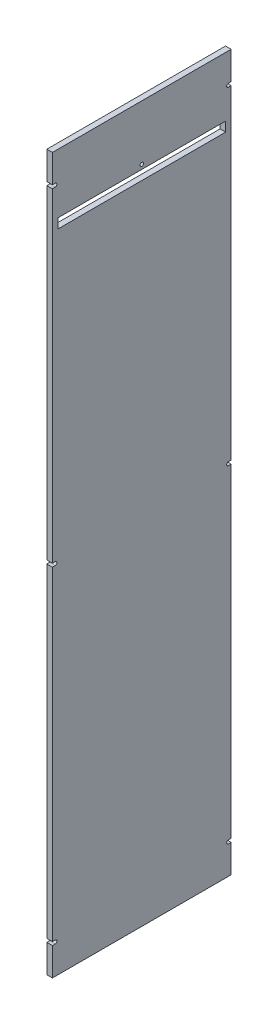
ISO-10303-21;
HEADER;
FILE_DESCRIPTION(('STEP AP214'),'2;1');
FILE_NAME('part.step','',(''),(''),'','','');
FILE_SCHEMA(('AUTOMOTIVE_DESIGN { 1 0 10303 214 1 1 1 1 }'));
ENDSEC;
DATA;
#1=APPLICATION_CONTEXT('core data for automotive mechanical design processes');
#2=APPLICATION_PROTOCOL_DEFINITION('international standard','automotive_design',2000,#1);
#3=PRODUCT_CONTEXT('',#1,'mechanical');
#4=PRODUCT('Part','Part','',(#3));
#5=PRODUCT_RELATED_PRODUCT_CATEGORY('part','',(#4));
#6=PRODUCT_DEFINITION_FORMATION('','',#4);
#7=PRODUCT_DEFINITION_CONTEXT('part definition',#1,'design');
#8=PRODUCT_DEFINITION('design','',#6,#7);
#9=PRODUCT_DEFINITION_SHAPE('','',#8);
#10=(LENGTH_UNIT() NAMED_UNIT(*) SI_UNIT(.MILLI.,.METRE.));
#11=(NAMED_UNIT(*) PLANE_ANGLE_UNIT() SI_UNIT($,.RADIAN.));
#12=(NAMED_UNIT(*) SI_UNIT($,.STERADIAN.) SOLID_ANGLE_UNIT());
#13=UNCERTAINTY_MEASURE_WITH_UNIT(LENGTH_MEASURE(1.E-05),#10,'distance_accuracy_value','');
#14=(GEOMETRIC_REPRESENTATION_CONTEXT(3) GLOBAL_UNCERTAINTY_ASSIGNED_CONTEXT((#13)) GLOBAL_UNIT_ASSIGNED_CONTEXT((#10,
#11,#12)) REPRESENTATION_CONTEXT('',''));
#15=CARTESIAN_POINT('',(0.,0.,0.));
#16=DIRECTION('',(0.,0.,1.));
#17=DIRECTION('',(1.,0.,0.));
#18=AXIS2_PLACEMENT_3D('',#15,#16,#17);
#19=CARTESIAN_POINT('',(0.,609.6,0.));
#20=DIRECTION('',(0.,0.,-1.));
#21=DIRECTION('',(-1.,0.,0.));
#22=AXIS2_PLACEMENT_3D('',#19,#20,#21);
#23=PLANE('',#22);
#24=DIRECTION('',(0.,-1.,0.));
#25=VECTOR('',#24,1.);
#26=CARTESIAN_POINT('',(0.,609.6,0.));
#27=LINE('',#26,#25);
#28=CARTESIAN_POINT('',(0.,303.3395,0.));
#29=VERTEX_POINT('',#28);
#30=CARTESIAN_POINT('',(0.,26.8605000000001,0.));
#31=VERTEX_POINT('',#30);
#32=EDGE_CURVE('E480',#29,#31,#27,.T.);
#33=ORIENTED_EDGE('',*,*,#32,.T.);
#34=DIRECTION('',(-1.,0.,0.));
#35=VECTOR('',#34,1.);
#36=CARTESIAN_POINT('',(4.7625,26.8605000000001,0.));
#37=LINE('',#36,#35);
#38=CARTESIAN_POINT('',(4.7625,26.8605000000001,0.));
#39=VERTEX_POINT('',#38);
#40=EDGE_CURVE('E336',#39,#31,#37,.T.);
#41=ORIENTED_EDGE('',*,*,#40,.F.);
#42=DIRECTION('',(0.,-1.,0.));
#43=VECTOR('',#42,1.);
#44=CARTESIAN_POINT('',(4.7625,609.6,0.));
#45=LINE('',#44,#43);
#46=CARTESIAN_POINT('',(4.7625,303.3395,0.));
#47=VERTEX_POINT('',#46);
#48=EDGE_CURVE('E482',#47,#39,#45,.T.);
#49=ORIENTED_EDGE('',*,*,#48,.F.);
#50=DIRECTION('',(-1.,0.,0.));
#51=VECTOR('',#50,1.);
#52=CARTESIAN_POINT('',(4.7625,303.3395,0.));
#53=LINE('',#52,#51);
#54=EDGE_CURVE('E312',#47,#29,#53,.T.);
#55=ORIENTED_EDGE('',*,*,#54,.T.);
#56=EDGE_LOOP('',(#33,#41,#49,#55));
#57=FACE_BOUND('',#56,.T.);
#58=ADVANCED_FACE('F35',(#57),#23,.F.);
#59=CARTESIAN_POINT('',(0.,582.7395,0.));
#60=VERTEX_POINT('',#59);
#61=CARTESIAN_POINT('',(0.,306.2605,0.));
#62=VERTEX_POINT('',#61);
#63=EDGE_CURVE('E43',#60,#62,#27,.T.);
#64=ORIENTED_EDGE('',*,*,#63,.T.);
#65=DIRECTION('',(-1.,0.,0.));
#66=VECTOR('',#65,1.);
#67=CARTESIAN_POINT('',(4.7625,306.2605,0.));
#68=LINE('',#67,#66);
#69=CARTESIAN_POINT('',(4.7625,306.2605,0.));
#70=VERTEX_POINT('',#69);
#71=EDGE_CURVE('E310',#70,#62,#68,.T.);
#72=ORIENTED_EDGE('',*,*,#71,.F.);
#73=CARTESIAN_POINT('',(4.7625,582.7395,0.));
#74=VERTEX_POINT('',#73);
#75=EDGE_CURVE('E476',#74,#70,#45,.T.);
#76=ORIENTED_EDGE('',*,*,#75,.F.);
#77=DIRECTION('',(-1.,0.,0.));
#78=VECTOR('',#77,1.);
#79=CARTESIAN_POINT('',(4.7625,582.7395,0.));
#80=LINE('',#79,#78);
#81=EDGE_CURVE('E440',#74,#60,#80,.T.);
#82=ORIENTED_EDGE('',*,*,#81,.T.);
#83=EDGE_LOOP('',(#64,#72,#76,#82));
#84=FACE_BOUND('',#83,.T.);
#85=ADVANCED_FACE('F546',(#84),#23,.F.);
#86=CARTESIAN_POINT('',(0.,609.6,-152.4));
#87=DIRECTION('',(0.,0.,1.));
#88=DIRECTION('',(1.,0.,0.));
#89=AXIS2_PLACEMENT_3D('',#86,#87,#88);
#90=PLANE('',#89);
#91=DIRECTION('',(0.,-1.,0.));
#92=VECTOR('',#91,1.);
#93=CARTESIAN_POINT('',(0.,609.6,-152.4));
#94=LINE('',#93,#92);
#95=CARTESIAN_POINT('',(0.,23.9395,-152.4));
#96=VERTEX_POINT('',#95);
#97=CARTESIAN_POINT('',(0.,0.,-152.4));
#98=VERTEX_POINT('',#97);
#99=EDGE_CURVE('E454',#96,#98,#94,.T.);
#100=ORIENTED_EDGE('',*,*,#99,.F.);
#101=DIRECTION('',(-1.,0.,0.));
#102=VECTOR('',#101,1.);
#103=CARTESIAN_POINT('',(4.7625,23.9395,-152.4));
#104=LINE('',#103,#102);
#105=CARTESIAN_POINT('',(4.7625,23.9395,-152.4));
#106=VERTEX_POINT('',#105);
#107=EDGE_CURVE('E360',#106,#96,#104,.T.);
#108=ORIENTED_EDGE('',*,*,#107,.F.);
#109=DIRECTION('',(0.,-1.,0.));
#110=VECTOR('',#109,1.);
#111=CARTESIAN_POINT('',(4.7625,609.6,-152.4));
#112=LINE('',#111,#110);
#113=CARTESIAN_POINT('',(4.7625,0.,-152.4));
#114=VERTEX_POINT('',#113);
#115=EDGE_CURVE('E468',#106,#114,#112,.T.);
#116=ORIENTED_EDGE('',*,*,#115,.T.);
#117=DIRECTION('',(-1.,0.,0.));
#118=VECTOR('',#117,1.);
#119=CARTESIAN_POINT('',(0.,0.,-152.4));
#120=LINE('',#119,#118);
#121=EDGE_CURVE('E448',#114,#98,#120,.T.);
#122=ORIENTED_EDGE('',*,*,#121,.T.);
#123=EDGE_LOOP('',(#100,#108,#116,#122));
#124=FACE_BOUND('',#123,.T.);
#125=ADVANCED_FACE('F543',(#124),#90,.F.);
#126=CARTESIAN_POINT('',(4.7625,303.3395,-152.4));
#127=VERTEX_POINT('',#126);
#128=CARTESIAN_POINT('',(4.7625,26.8605000000001,-152.4));
#129=VERTEX_POINT('',#128);
#130=EDGE_CURVE('E516',#127,#129,#112,.T.);
#131=ORIENTED_EDGE('',*,*,#130,.T.);
#132=DIRECTION('',(-1.,0.,0.));
#133=VECTOR('',#132,1.);
#134=CARTESIAN_POINT('',(4.7625,26.8605000000001,-152.4));
#135=LINE('',#134,#133);
#136=CARTESIAN_POINT('',(0.,26.8605000000003,-152.4));
#137=VERTEX_POINT('',#136);
#138=EDGE_CURVE('E362',#129,#137,#135,.T.);
#139=ORIENTED_EDGE('',*,*,#138,.T.);
#140=CARTESIAN_POINT('',(0.,303.3395,-152.4));
#141=VERTEX_POINT('',#140);
#142=EDGE_CURVE('E537',#141,#137,#94,.T.);
#143=ORIENTED_EDGE('',*,*,#142,.F.);
#144=DIRECTION('',(-1.,0.,0.));
#145=VECTOR('',#144,1.);
#146=CARTESIAN_POINT('',(4.7625,303.3395,-152.4));
#147=LINE('',#146,#145);
#148=EDGE_CURVE('E412',#127,#141,#147,.T.);
#149=ORIENTED_EDGE('',*,*,#148,.F.);
#150=EDGE_LOOP('',(#131,#139,#143,#149));
#151=FACE_BOUND('',#150,.T.);
#152=ADVANCED_FACE('F545',(#151),#90,.F.);
#153=CARTESIAN_POINT('',(4.7625,582.7395,-152.4));
#154=VERTEX_POINT('',#153);
#155=CARTESIAN_POINT('',(4.7625,306.2605,-152.4));
#156=VERTEX_POINT('',#155);
#157=EDGE_CURVE('E473',#154,#156,#112,.T.);
#158=ORIENTED_EDGE('',*,*,#157,.T.);
#159=DIRECTION('',(-1.,0.,0.));
#160=VECTOR('',#159,1.);
#161=CARTESIAN_POINT('',(4.7625,306.2605,-152.4));
#162=LINE('',#161,#160);
#163=CARTESIAN_POINT('',(0.,306.2605,-152.4));
#164=VERTEX_POINT('',#163);
#165=EDGE_CURVE('E414',#156,#164,#162,.T.);
#166=ORIENTED_EDGE('',*,*,#165,.T.);
#167=CARTESIAN_POINT('',(0.,582.7395,-152.4));
#168=VERTEX_POINT('',#167);
#169=EDGE_CURVE('E469',#168,#164,#94,.T.);
#170=ORIENTED_EDGE('',*,*,#169,.F.);
#171=DIRECTION('',(-1.,0.,0.));
#172=VECTOR('',#171,1.);
#173=CARTESIAN_POINT('',(4.7625,582.7395,-152.4));
#174=LINE('',#173,#172);
#175=EDGE_CURVE('E388',#154,#168,#174,.T.);
#176=ORIENTED_EDGE('',*,*,#175,.F.);
#177=EDGE_LOOP('',(#158,#166,#170,#176));
#178=FACE_BOUND('',#177,.T.);
#179=ADVANCED_FACE('F525',(#178),#90,.F.);
#180=CARTESIAN_POINT('',(0.,609.6,0.));
#181=VERTEX_POINT('',#180);
#182=CARTESIAN_POINT('',(0.,585.6605,0.));
#183=VERTEX_POINT('',#182);
#184=EDGE_CURVE('E11',#181,#183,#27,.T.);
#185=ORIENTED_EDGE('',*,*,#184,.T.);
#186=DIRECTION('',(-1.,0.,0.));
#187=VECTOR('',#186,1.);
#188=CARTESIAN_POINT('',(4.7625,585.6605,0.));
#189=LINE('',#188,#187);
#190=CARTESIAN_POINT('',(4.7625,585.6605,0.));
#191=VERTEX_POINT('',#190);
#192=EDGE_CURVE('E438',#191,#183,#189,.T.);
#193=ORIENTED_EDGE('',*,*,#192,.F.);
#194=CARTESIAN_POINT('',(4.7625,609.6,0.));
#195=VERTEX_POINT('',#194);
#196=EDGE_CURVE('E474',#195,#191,#45,.T.);
#197=ORIENTED_EDGE('',*,*,#196,.F.);
#198=DIRECTION('',(1.,0.,0.));
#199=VECTOR('',#198,1.);
#200=CARTESIAN_POINT('',(0.,609.6,0.));
#201=LINE('',#200,#199);
#202=EDGE_CURVE('E447',#181,#195,#201,.T.);
#203=ORIENTED_EDGE('',*,*,#202,.F.);
#204=EDGE_LOOP('',(#185,#193,#197,#203));
#205=FACE_BOUND('',#204,.T.);
#206=ADVANCED_FACE('F554',(#205),#23,.F.);
#207=CARTESIAN_POINT('',(0.,609.6,0.));
#208=DIRECTION('',(1.,0.,0.));
#209=DIRECTION('',(0.,0.,-1.));
#210=AXIS2_PLACEMENT_3D('',#207,#208,#209);
#211=PLANE('',#210);
#212=DIRECTION('',(0.,1.,0.));
#213=VECTOR('',#212,1.);
#214=CARTESIAN_POINT('',(0.,558.927,-4.6355));
#215=LINE('',#214,#213);
#216=CARTESIAN_POINT('',(0.,550.7355,-4.6355));
#217=VERTEX_POINT('',#216);
#218=CARTESIAN_POINT('',(0.,558.927,-4.6355));
#219=VERTEX_POINT('',#218);
#220=EDGE_CURVE('E272',#217,#219,#215,.T.);
#221=ORIENTED_EDGE('',*,*,#220,.F.);
#222=DIRECTION('',(0.,0.,1.));
#223=VECTOR('',#222,1.);
#224=CARTESIAN_POINT('',(0.,550.7355,-4.6355));
#225=LINE('',#224,#223);
#226=CARTESIAN_POINT('',(0.,550.7355,-147.7645));
#227=VERTEX_POINT('',#226);
#228=EDGE_CURVE('E51',#227,#217,#225,.T.);
#229=ORIENTED_EDGE('',*,*,#228,.F.);
#230=DIRECTION('',(0.,-1.,0.));
#231=VECTOR('',#230,1.);
#232=CARTESIAN_POINT('',(0.,550.7355,-147.7645));
#233=LINE('',#232,#231);
#234=CARTESIAN_POINT('',(0.,558.927,-147.7645));
#235=VERTEX_POINT('',#234);
#236=EDGE_CURVE('E263',#235,#227,#233,.T.);
#237=ORIENTED_EDGE('',*,*,#236,.F.);
#238=DIRECTION('',(0.,0.,-1.));
#239=VECTOR('',#238,1.);
#240=CARTESIAN_POINT('',(0.,558.927,-147.7645));
#241=LINE('',#240,#239);
#242=EDGE_CURVE('E266',#219,#235,#241,.T.);
#243=ORIENTED_EDGE('',*,*,#242,.F.);
#244=EDGE_LOOP('',(#221,#229,#237,#243));
#245=FACE_BOUND('',#244,.T.);
#246=CARTESIAN_POINT('',(0.,562.76875,-76.2));
#247=DIRECTION('',(-1.,0.,0.));
#248=DIRECTION('',(0.,0.,1.));
#249=AXIS2_PLACEMENT_3D('',#246,#247,#248);
#250=CIRCLE('',#249,1.47319999999995);
#251=CARTESIAN_POINT('',(0.,562.76875,-74.7268000000001));
#252=VERTEX_POINT('',#251);
#253=EDGE_CURVE('E278',#252,#252,#250,.T.);
#254=ORIENTED_EDGE('',*,*,#253,.F.);
#255=EDGE_LOOP('',(#254));
#256=FACE_BOUND('',#255,.T.);
#257=CARTESIAN_POINT('',(0.,25.4,-150.01875));
#258=DIRECTION('',(-1.,0.,0.));
#259=DIRECTION('',(0.,0.,1.));
#260=AXIS2_PLACEMENT_3D('',#257,#258,#259);
#261=CIRCLE('',#260,1.46050000000005);
#262=CARTESIAN_POINT('',(0.,23.9395,-150.01875));
#263=VERTEX_POINT('',#262);
#264=CARTESIAN_POINT('',(0.,26.8605000000001,-150.01875));
#265=VERTEX_POINT('',#264);
#266=EDGE_CURVE('E287',#263,#265,#261,.T.);
#267=ORIENTED_EDGE('',*,*,#266,.F.);
#268=DIRECTION('',(0.,0.,1.));
#269=VECTOR('',#268,1.);
#270=CARTESIAN_POINT('',(0.,23.9395,-150.01875));
#271=LINE('',#270,#269);
#272=EDGE_CURVE('E346',#96,#263,#271,.T.);
#273=ORIENTED_EDGE('',*,*,#272,.F.);
#274=ORIENTED_EDGE('',*,*,#99,.T.);
#275=DIRECTION('',(0.,0.,1.));
#276=VECTOR('',#275,1.);
#277=CARTESIAN_POINT('',(0.,0.,0.));
#278=LINE('',#277,#276);
#279=CARTESIAN_POINT('',(0.,0.,0.));
#280=VERTEX_POINT('',#279);
#281=EDGE_CURVE('E437',#98,#280,#278,.T.);
#282=ORIENTED_EDGE('',*,*,#281,.T.);
#283=CARTESIAN_POINT('',(0.,23.9395,0.));
#284=VERTEX_POINT('',#283);
#285=EDGE_CURVE('E44',#284,#280,#27,.T.);
#286=ORIENTED_EDGE('',*,*,#285,.F.);
#287=DIRECTION('',(0.,0.,1.));
#288=VECTOR('',#287,1.);
#289=CARTESIAN_POINT('',(0.,23.9395,-2.38125));
#290=LINE('',#289,#288);
#291=CARTESIAN_POINT('',(0.,23.9395,-2.38125));
#292=VERTEX_POINT('',#291);
#293=EDGE_CURVE('E330',#292,#284,#290,.T.);
#294=ORIENTED_EDGE('',*,*,#293,.F.);
#295=CARTESIAN_POINT('',(0.,25.4,-2.38125));
#296=DIRECTION('',(-1.,0.,0.));
#297=DIRECTION('',(0.,0.,1.));
#298=AXIS2_PLACEMENT_3D('',#295,#296,#297);
#299=CIRCLE('',#298,1.46050000000005);
#300=CARTESIAN_POINT('',(0.,26.8605000000001,-2.38125));
#301=VERTEX_POINT('',#300);
#302=EDGE_CURVE('E327',#301,#292,#299,.T.);
#303=ORIENTED_EDGE('',*,*,#302,.F.);
#304=DIRECTION('',(0.,0.,-1.));
#305=VECTOR('',#304,1.);
#306=CARTESIAN_POINT('',(0.,26.8605000000001,-2.38125));
#307=LINE('',#306,#305);
#308=EDGE_CURVE('E320',#31,#301,#307,.T.);
#309=ORIENTED_EDGE('',*,*,#308,.F.);
#310=ORIENTED_EDGE('',*,*,#32,.F.);
#311=DIRECTION('',(0.,0.,1.));
#312=VECTOR('',#311,1.);
#313=CARTESIAN_POINT('',(0.,303.3395,-2.38125));
#314=LINE('',#313,#312);
#315=CARTESIAN_POINT('',(0.,303.3395,-2.38125));
#316=VERTEX_POINT('',#315);
#317=EDGE_CURVE('E302',#316,#29,#314,.T.);
#318=ORIENTED_EDGE('',*,*,#317,.F.);
#319=CARTESIAN_POINT('',(0.,304.8,-2.38125));
#320=DIRECTION('',(-1.,0.,0.));
#321=DIRECTION('',(0.,0.,1.));
#322=AXIS2_PLACEMENT_3D('',#319,#320,#321);
#323=CIRCLE('',#322,1.46049999999998);
#324=CARTESIAN_POINT('',(0.,306.2605,-2.38125));
#325=VERTEX_POINT('',#324);
#326=EDGE_CURVE('E299',#325,#316,#323,.T.);
#327=ORIENTED_EDGE('',*,*,#326,.F.);
#328=DIRECTION('',(0.,0.,-1.));
#329=VECTOR('',#328,1.);
#330=CARTESIAN_POINT('',(0.,306.2605,-2.38125));
#331=LINE('',#330,#329);
#332=EDGE_CURVE('E292',#62,#325,#331,.T.);
#333=ORIENTED_EDGE('',*,*,#332,.F.);
#334=ORIENTED_EDGE('',*,*,#63,.F.);
#335=DIRECTION('',(0.,0.,1.));
#336=VECTOR('',#335,1.);
#337=CARTESIAN_POINT('',(0.,582.7395,-2.38125));
#338=LINE('',#337,#336);
#339=CARTESIAN_POINT('',(0.,582.7395,-2.38125));
#340=VERTEX_POINT('',#339);
#341=EDGE_CURVE('E431',#340,#60,#338,.T.);
#342=ORIENTED_EDGE('',*,*,#341,.F.);
#343=CARTESIAN_POINT('',(0.,584.2,-2.38125));
#344=DIRECTION('',(-1.,0.,0.));
#345=DIRECTION('',(0.,0.,1.));
#346=AXIS2_PLACEMENT_3D('',#343,#344,#345);
#347=CIRCLE('',#346,1.46049999999998);
#348=CARTESIAN_POINT('',(0.,585.6605,-2.38125));
#349=VERTEX_POINT('',#348);
#350=EDGE_CURVE('E387',#349,#340,#347,.T.);
#351=ORIENTED_EDGE('',*,*,#350,.F.);
#352=DIRECTION('',(0.,0.,-1.));
#353=VECTOR('',#352,1.);
#354=CARTESIAN_POINT('',(0.,585.6605,-2.38125));
#355=LINE('',#354,#353);
#356=EDGE_CURVE('E422',#183,#349,#355,.T.);
#357=ORIENTED_EDGE('',*,*,#356,.F.);
#358=ORIENTED_EDGE('',*,*,#184,.F.);
#359=DIRECTION('',(0.,0.,1.));
#360=VECTOR('',#359,1.);
#361=CARTESIAN_POINT('',(0.,609.6,0.));
#362=LINE('',#361,#360);
#363=CARTESIAN_POINT('',(0.,609.6,-152.4));
#364=VERTEX_POINT('',#363);
#365=EDGE_CURVE('E444',#364,#181,#362,.T.);
#366=ORIENTED_EDGE('',*,*,#365,.F.);
#367=CARTESIAN_POINT('',(0.,585.6605,-152.4));
#368=VERTEX_POINT('',#367);
#369=EDGE_CURVE('E465',#364,#368,#94,.T.);
#370=ORIENTED_EDGE('',*,*,#369,.T.);
#371=DIRECTION('',(0.,0.,-1.));
#372=VECTOR('',#371,1.);
#373=CARTESIAN_POINT('',(0.,585.6605,-150.01875));
#374=LINE('',#373,#372);
#375=CARTESIAN_POINT('',(0.,585.6605,-150.01875));
#376=VERTEX_POINT('',#375);
#377=EDGE_CURVE('E380',#376,#368,#374,.T.);
#378=ORIENTED_EDGE('',*,*,#377,.F.);
#379=CARTESIAN_POINT('',(0.,584.2,-150.01875));
#380=DIRECTION('',(-1.,0.,0.));
#381=DIRECTION('',(0.,0.,1.));
#382=AXIS2_PLACEMENT_3D('',#379,#380,#381);
#383=CIRCLE('',#382,1.46049999999998);
#384=CARTESIAN_POINT('',(0.,582.7395,-150.01875));
#385=VERTEX_POINT('',#384);
#386=EDGE_CURVE('E377',#385,#376,#383,.T.);
#387=ORIENTED_EDGE('',*,*,#386,.F.);
#388=DIRECTION('',(0.,0.,1.));
#389=VECTOR('',#388,1.);
#390=CARTESIAN_POINT('',(0.,582.7395,-150.01875));
#391=LINE('',#390,#389);
#392=EDGE_CURVE('E370',#168,#385,#391,.T.);
#393=ORIENTED_EDGE('',*,*,#392,.F.);
#394=ORIENTED_EDGE('',*,*,#169,.T.);
#395=DIRECTION('',(0.,0.,-1.));
#396=VECTOR('',#395,1.);
#397=CARTESIAN_POINT('',(0.,306.2605,-150.01875));
#398=LINE('',#397,#396);
#399=CARTESIAN_POINT('',(0.,306.2605,-150.01875));
#400=VERTEX_POINT('',#399);
#401=EDGE_CURVE('E407',#400,#164,#398,.T.);
#402=ORIENTED_EDGE('',*,*,#401,.F.);
#403=CARTESIAN_POINT('',(0.,304.8,-150.01875));
#404=DIRECTION('',(-1.,0.,0.));
#405=DIRECTION('',(0.,0.,1.));
#406=AXIS2_PLACEMENT_3D('',#403,#404,#405);
#407=CIRCLE('',#406,1.46049999999998);
#408=CARTESIAN_POINT('',(0.,303.3395,-150.01875));
#409=VERTEX_POINT('',#408);
#410=EDGE_CURVE('E309',#409,#400,#407,.T.);
#411=ORIENTED_EDGE('',*,*,#410,.F.);
#412=DIRECTION('',(0.,0.,1.));
#413=VECTOR('',#412,1.);
#414=CARTESIAN_POINT('',(0.,303.3395,-150.01875));
#415=LINE('',#414,#413);
#416=EDGE_CURVE('E398',#141,#409,#415,.T.);
#417=ORIENTED_EDGE('',*,*,#416,.F.);
#418=ORIENTED_EDGE('',*,*,#142,.T.);
#419=DIRECTION('',(0.,0.,-1.));
#420=VECTOR('',#419,1.);
#421=CARTESIAN_POINT('',(0.,26.8605000000001,-150.01875));
#422=LINE('',#421,#420);
#423=EDGE_CURVE('E355',#265,#137,#422,.T.);
#424=ORIENTED_EDGE('',*,*,#423,.F.);
#425=EDGE_LOOP('',(#267,#273,#274,#282,#286,#294,#303,#309,#310,#318,#327,#333,#334,#342,#351,
#357,#358,#366,#370,#378,#387,#393,#394,#402,#411,#417,#418,#424));
#426=FACE_BOUND('',#425,.T.);
#427=ADVANCED_FACE('F37',(#245,#256,#426),#211,.F.);
#428=CARTESIAN_POINT('',(4.7625,23.9395000000003,0.));
#429=VERTEX_POINT('',#428);
#430=CARTESIAN_POINT('',(4.7625,0.,0.));
#431=VERTEX_POINT('',#430);
#432=EDGE_CURVE('E472',#429,#431,#45,.T.);
#433=ORIENTED_EDGE('',*,*,#432,.F.);
#434=DIRECTION('',(-1.,0.,0.));
#435=VECTOR('',#434,1.);
#436=CARTESIAN_POINT('',(4.7625,23.9395,0.));
#437=LINE('',#436,#435);
#438=EDGE_CURVE('E338',#429,#284,#437,.T.);
#439=ORIENTED_EDGE('',*,*,#438,.T.);
#440=ORIENTED_EDGE('',*,*,#285,.T.);
#441=DIRECTION('',(1.,0.,0.));
#442=VECTOR('',#441,1.);
#443=CARTESIAN_POINT('',(0.,0.,0.));
#444=LINE('',#443,#442);
#445=EDGE_CURVE('E457',#280,#431,#444,.T.);
#446=ORIENTED_EDGE('',*,*,#445,.T.);
#447=EDGE_LOOP('',(#433,#439,#440,#446));
#448=FACE_BOUND('',#447,.T.);
#449=ADVANCED_FACE('F507',(#448),#23,.F.);
#450=CARTESIAN_POINT('',(4.7625,609.6,0.));
#451=DIRECTION('',(-1.,0.,0.));
#452=DIRECTION('',(0.,0.,1.));
#453=AXIS2_PLACEMENT_3D('',#450,#451,#452);
#454=PLANE('',#453);
#455=DIRECTION('',(0.,-1.,0.));
#456=VECTOR('',#455,1.);
#457=CARTESIAN_POINT('',(4.7625,550.7355,-147.7645));
#458=LINE('',#457,#456);
#459=CARTESIAN_POINT('',(4.7625,558.927,-147.7645));
#460=VERTEX_POINT('',#459);
#461=CARTESIAN_POINT('',(4.7625,550.7355,-147.7645));
#462=VERTEX_POINT('',#461);
#463=EDGE_CURVE('E253',#460,#462,#458,.T.);
#464=ORIENTED_EDGE('',*,*,#463,.T.);
#465=DIRECTION('',(0.,0.,1.));
#466=VECTOR('',#465,1.);
#467=CARTESIAN_POINT('',(4.7625,550.7355,-4.6355));
#468=LINE('',#467,#466);
#469=CARTESIAN_POINT('',(4.7625,550.7355,-4.6355));
#470=VERTEX_POINT('',#469);
#471=EDGE_CURVE('E247',#462,#470,#468,.T.);
#472=ORIENTED_EDGE('',*,*,#471,.T.);
#473=DIRECTION('',(0.,1.,0.));
#474=VECTOR('',#473,1.);
#475=CARTESIAN_POINT('',(4.7625,558.927,-4.6355));
#476=LINE('',#475,#474);
#477=CARTESIAN_POINT('',(4.7625,558.927,-4.6355));
#478=VERTEX_POINT('',#477);
#479=EDGE_CURVE('E256',#470,#478,#476,.T.);
#480=ORIENTED_EDGE('',*,*,#479,.T.);
#481=DIRECTION('',(0.,0.,-1.));
#482=VECTOR('',#481,1.);
#483=CARTESIAN_POINT('',(4.7625,558.927,-147.7645));
#484=LINE('',#483,#482);
#485=EDGE_CURVE('E59',#478,#460,#484,.T.);
#486=ORIENTED_EDGE('',*,*,#485,.T.);
#487=EDGE_LOOP('',(#464,#472,#480,#486));
#488=FACE_BOUND('',#487,.T.);
#489=CARTESIAN_POINT('',(4.7625,562.76875,-76.2));
#490=DIRECTION('',(-1.,0.,0.));
#491=DIRECTION('',(0.,0.,1.));
#492=AXIS2_PLACEMENT_3D('',#489,#490,#491);
#493=CIRCLE('',#492,1.47319999999995);
#494=CARTESIAN_POINT('',(4.7625,562.76875,-74.7268000000001));
#495=VERTEX_POINT('',#494);
#496=EDGE_CURVE('E284',#495,#495,#493,.T.);
#497=ORIENTED_EDGE('',*,*,#496,.T.);
#498=EDGE_LOOP('',(#497));
#499=FACE_BOUND('',#498,.T.);
#500=ORIENTED_EDGE('',*,*,#115,.F.);
#501=DIRECTION('',(0.,0.,1.));
#502=VECTOR('',#501,1.);
#503=CARTESIAN_POINT('',(4.7625,23.9395,-150.01875));
#504=LINE('',#503,#502);
#505=CARTESIAN_POINT('',(4.7625,23.9395,-150.01875));
#506=VERTEX_POINT('',#505);
#507=EDGE_CURVE('E349',#106,#506,#504,.T.);
#508=ORIENTED_EDGE('',*,*,#507,.T.);
#509=CARTESIAN_POINT('',(4.7625,25.4,-150.01875));
#510=DIRECTION('',(-1.,0.,0.));
#511=DIRECTION('',(0.,0.,1.));
#512=AXIS2_PLACEMENT_3D('',#509,#510,#511);
#513=CIRCLE('',#512,1.46050000000005);
#514=CARTESIAN_POINT('',(4.7625,26.8605000000001,-150.01875));
#515=VERTEX_POINT('',#514);
#516=EDGE_CURVE('E342',#506,#515,#513,.T.);
#517=ORIENTED_EDGE('',*,*,#516,.T.);
#518=DIRECTION('',(0.,0.,-1.));
#519=VECTOR('',#518,1.);
#520=CARTESIAN_POINT('',(4.7625,26.8605000000001,-150.01875));
#521=LINE('',#520,#519);
#522=EDGE_CURVE('E345',#515,#129,#521,.T.);
#523=ORIENTED_EDGE('',*,*,#522,.T.);
#524=ORIENTED_EDGE('',*,*,#130,.F.);
#525=DIRECTION('',(0.,0.,1.));
#526=VECTOR('',#525,1.);
#527=CARTESIAN_POINT('',(4.7625,303.3395,-150.01875));
#528=LINE('',#527,#526);
#529=CARTESIAN_POINT('',(4.7625,303.3395,-150.01875));
#530=VERTEX_POINT('',#529);
#531=EDGE_CURVE('E401',#127,#530,#528,.T.);
#532=ORIENTED_EDGE('',*,*,#531,.T.);
#533=CARTESIAN_POINT('',(4.7625,304.8,-150.01875));
#534=DIRECTION('',(-1.,0.,0.));
#535=DIRECTION('',(0.,0.,1.));
#536=AXIS2_PLACEMENT_3D('',#533,#534,#535);
#537=CIRCLE('',#536,1.46049999999998);
#538=CARTESIAN_POINT('',(4.7625,306.2605,-150.01875));
#539=VERTEX_POINT('',#538);
#540=EDGE_CURVE('E394',#530,#539,#537,.T.);
#541=ORIENTED_EDGE('',*,*,#540,.T.);
#542=DIRECTION('',(0.,0.,-1.));
#543=VECTOR('',#542,1.);
#544=CARTESIAN_POINT('',(4.7625,306.2605,-150.01875));
#545=LINE('',#544,#543);
#546=EDGE_CURVE('E397',#539,#156,#545,.T.);
#547=ORIENTED_EDGE('',*,*,#546,.T.);
#548=ORIENTED_EDGE('',*,*,#157,.F.);
#549=DIRECTION('',(0.,0.,1.));
#550=VECTOR('',#549,1.);
#551=CARTESIAN_POINT('',(4.7625,582.7395,-150.01875));
#552=LINE('',#551,#550);
#553=CARTESIAN_POINT('',(4.7625,582.7395,-150.01875));
#554=VERTEX_POINT('',#553);
#555=EDGE_CURVE('E373',#154,#554,#552,.T.);
#556=ORIENTED_EDGE('',*,*,#555,.T.);
#557=CARTESIAN_POINT('',(4.7625,584.2,-150.01875));
#558=DIRECTION('',(-1.,0.,0.));
#559=DIRECTION('',(0.,0.,1.));
#560=AXIS2_PLACEMENT_3D('',#557,#558,#559);
#561=CIRCLE('',#560,1.46049999999998);
#562=CARTESIAN_POINT('',(4.7625,585.6605,-150.01875));
#563=VERTEX_POINT('',#562);
#564=EDGE_CURVE('E366',#554,#563,#561,.T.);
#565=ORIENTED_EDGE('',*,*,#564,.T.);
#566=DIRECTION('',(0.,0.,-1.));
#567=VECTOR('',#566,1.);
#568=CARTESIAN_POINT('',(4.7625,585.6605,-150.01875));
#569=LINE('',#568,#567);
#570=CARTESIAN_POINT('',(4.7625,585.6605,-152.4));
#571=VERTEX_POINT('',#570);
#572=EDGE_CURVE('E369',#563,#571,#569,.T.);
#573=ORIENTED_EDGE('',*,*,#572,.T.);
#574=CARTESIAN_POINT('',(4.7625,609.6,-152.4));
#575=VERTEX_POINT('',#574);
#576=EDGE_CURVE('E470',#575,#571,#112,.T.);
#577=ORIENTED_EDGE('',*,*,#576,.F.);
#578=DIRECTION('',(0.,0.,-1.));
#579=VECTOR('',#578,1.);
#580=CARTESIAN_POINT('',(4.7625,609.6,0.));
#581=LINE('',#580,#579);
#582=EDGE_CURVE('E450',#195,#575,#581,.T.);
#583=ORIENTED_EDGE('',*,*,#582,.F.);
#584=ORIENTED_EDGE('',*,*,#196,.T.);
#585=DIRECTION('',(0.,0.,-1.));
#586=VECTOR('',#585,1.);
#587=CARTESIAN_POINT('',(4.7625,585.6605,-2.38125));
#588=LINE('',#587,#586);
#589=CARTESIAN_POINT('',(4.7625,585.6605,-2.38125));
#590=VERTEX_POINT('',#589);
#591=EDGE_CURVE('E425',#191,#590,#588,.T.);
#592=ORIENTED_EDGE('',*,*,#591,.T.);
#593=CARTESIAN_POINT('',(4.7625,584.2,-2.38125));
#594=DIRECTION('',(-1.,0.,0.));
#595=DIRECTION('',(0.,0.,1.));
#596=AXIS2_PLACEMENT_3D('',#593,#594,#595);
#597=CIRCLE('',#596,1.46049999999998);
#598=CARTESIAN_POINT('',(4.7625,582.7395,-2.38125));
#599=VERTEX_POINT('',#598);
#600=EDGE_CURVE('E418',#590,#599,#597,.T.);
#601=ORIENTED_EDGE('',*,*,#600,.T.);
#602=DIRECTION('',(0.,0.,1.));
#603=VECTOR('',#602,1.);
#604=CARTESIAN_POINT('',(4.7625,582.7395,-2.38125));
#605=LINE('',#604,#603);
#606=EDGE_CURVE('E421',#599,#74,#605,.T.);
#607=ORIENTED_EDGE('',*,*,#606,.T.);
#608=ORIENTED_EDGE('',*,*,#75,.T.);
#609=DIRECTION('',(0.,0.,-1.));
#610=VECTOR('',#609,1.);
#611=CARTESIAN_POINT('',(4.7625,306.2605,-2.38125));
#612=LINE('',#611,#610);
#613=CARTESIAN_POINT('',(4.7625,306.2605,-2.38125));
#614=VERTEX_POINT('',#613);
#615=EDGE_CURVE('E295',#70,#614,#612,.T.);
#616=ORIENTED_EDGE('',*,*,#615,.T.);
#617=CARTESIAN_POINT('',(4.7625,304.8,-2.38125));
#618=DIRECTION('',(-1.,0.,0.));
#619=DIRECTION('',(0.,0.,1.));
#620=AXIS2_PLACEMENT_3D('',#617,#618,#619);
#621=CIRCLE('',#620,1.46049999999998);
#622=CARTESIAN_POINT('',(4.7625,303.3395,-2.38125));
#623=VERTEX_POINT('',#622);
#624=EDGE_CURVE('E288',#614,#623,#621,.T.);
#625=ORIENTED_EDGE('',*,*,#624,.T.);
#626=DIRECTION('',(0.,0.,1.));
#627=VECTOR('',#626,1.);
#628=CARTESIAN_POINT('',(4.7625,303.3395,-2.38125));
#629=LINE('',#628,#627);
#630=EDGE_CURVE('E291',#623,#47,#629,.T.);
#631=ORIENTED_EDGE('',*,*,#630,.T.);
#632=ORIENTED_EDGE('',*,*,#48,.T.);
#633=DIRECTION('',(0.,0.,-1.));
#634=VECTOR('',#633,1.);
#635=CARTESIAN_POINT('',(4.7625,26.8605000000001,-2.38125));
#636=LINE('',#635,#634);
#637=CARTESIAN_POINT('',(4.7625,26.8605000000001,-2.38125));
#638=VERTEX_POINT('',#637);
#639=EDGE_CURVE('E323',#39,#638,#636,.T.);
#640=ORIENTED_EDGE('',*,*,#639,.T.);
#641=CARTESIAN_POINT('',(4.7625,25.4,-2.38125));
#642=DIRECTION('',(-1.,0.,0.));
#643=DIRECTION('',(0.,0.,1.));
#644=AXIS2_PLACEMENT_3D('',#641,#642,#643);
#645=CIRCLE('',#644,1.46050000000005);
#646=CARTESIAN_POINT('',(4.7625,23.9395,-2.38125));
#647=VERTEX_POINT('',#646);
#648=EDGE_CURVE('E316',#638,#647,#645,.T.);
#649=ORIENTED_EDGE('',*,*,#648,.T.);
#650=DIRECTION('',(0.,0.,1.));
#651=VECTOR('',#650,1.);
#652=CARTESIAN_POINT('',(4.7625,23.9395,-2.38125));
#653=LINE('',#652,#651);
#654=EDGE_CURVE('E319',#647,#429,#653,.T.);
#655=ORIENTED_EDGE('',*,*,#654,.T.);
#656=ORIENTED_EDGE('',*,*,#432,.T.);
#657=DIRECTION('',(0.,0.,-1.));
#658=VECTOR('',#657,1.);
#659=CARTESIAN_POINT('',(4.7625,0.,0.));
#660=LINE('',#659,#658);
#661=EDGE_CURVE('E460',#431,#114,#660,.T.);
#662=ORIENTED_EDGE('',*,*,#661,.T.);
#663=EDGE_LOOP('',(#500,#508,#517,#523,#524,#532,#541,#547,#548,#556,#565,#573,#577,#583,#584,
#592,#601,#607,#608,#616,#625,#631,#632,#640,#649,#655,#656,#662));
#664=FACE_BOUND('',#663,.T.);
#665=ADVANCED_FACE('F260',(#488,#499,#664),#454,.F.);
#666=ORIENTED_EDGE('',*,*,#576,.T.);
#667=DIRECTION('',(-1.,0.,0.));
#668=VECTOR('',#667,1.);
#669=CARTESIAN_POINT('',(4.7625,585.6605,-152.4));
#670=LINE('',#669,#668);
#671=EDGE_CURVE('E390',#571,#368,#670,.T.);
#672=ORIENTED_EDGE('',*,*,#671,.T.);
#673=ORIENTED_EDGE('',*,*,#369,.F.);
#674=DIRECTION('',(-1.,0.,0.));
#675=VECTOR('',#674,1.);
#676=CARTESIAN_POINT('',(0.,609.6,-152.4));
#677=LINE('',#676,#675);
#678=EDGE_CURVE('E452',#575,#364,#677,.T.);
#679=ORIENTED_EDGE('',*,*,#678,.F.);
#680=EDGE_LOOP('',(#666,#672,#673,#679));
#681=FACE_BOUND('',#680,.T.);
#682=ADVANCED_FACE('F548',(#681),#90,.F.);
#683=CARTESIAN_POINT('',(0.,609.6,0.));
#684=DIRECTION('',(0.,-1.,0.));
#685=DIRECTION('',(0.,0.,-1.));
#686=AXIS2_PLACEMENT_3D('',#683,#684,#685);
#687=PLANE('',#686);
#688=ORIENTED_EDGE('',*,*,#365,.T.);
#689=ORIENTED_EDGE('',*,*,#202,.T.);
#690=ORIENTED_EDGE('',*,*,#582,.T.);
#691=ORIENTED_EDGE('',*,*,#678,.T.);
#692=EDGE_LOOP('',(#688,#689,#690,#691));
#693=FACE_BOUND('',#692,.T.);
#694=ADVANCED_FACE('F558',(#693),#687,.F.);
#695=CARTESIAN_POINT('',(0.,0.,0.));
#696=DIRECTION('',(0.,-1.,0.));
#697=DIRECTION('',(0.,0.,-1.));
#698=AXIS2_PLACEMENT_3D('',#695,#696,#697);
#699=PLANE('',#698);
#700=ORIENTED_EDGE('',*,*,#281,.F.);
#701=ORIENTED_EDGE('',*,*,#121,.F.);
#702=ORIENTED_EDGE('',*,*,#661,.F.);
#703=ORIENTED_EDGE('',*,*,#445,.F.);
#704=EDGE_LOOP('',(#700,#701,#702,#703));
#705=FACE_BOUND('',#704,.T.);
#706=ADVANCED_FACE('F513',(#705),#699,.T.);
#707=CARTESIAN_POINT('',(4.7625,584.2,-2.38125));
#708=DIRECTION('',(-1.,0.,0.));
#709=DIRECTION('',(0.,0.,1.));
#710=AXIS2_PLACEMENT_3D('',#707,#708,#709);
#711=CYLINDRICAL_SURFACE('',#710,1.46049999999998);
#712=ORIENTED_EDGE('',*,*,#350,.T.);
#713=DIRECTION('',(-1.,0.,0.));
#714=VECTOR('',#713,1.);
#715=CARTESIAN_POINT('',(4.7625,582.7395,-2.38125));
#716=LINE('',#715,#714);
#717=EDGE_CURVE('E428',#599,#340,#716,.T.);
#718=ORIENTED_EDGE('',*,*,#717,.F.);
#719=ORIENTED_EDGE('',*,*,#600,.F.);
#720=DIRECTION('',(-1.,0.,0.));
#721=VECTOR('',#720,1.);
#722=CARTESIAN_POINT('',(4.7625,585.6605,-2.38125));
#723=LINE('',#722,#721);
#724=EDGE_CURVE('E435',#590,#349,#723,.T.);
#725=ORIENTED_EDGE('',*,*,#724,.T.);
#726=EDGE_LOOP('',(#712,#718,#719,#725));
#727=FACE_BOUND('',#726,.T.);
#728=ADVANCED_FACE('F588',(#727),#711,.F.);
#729=CARTESIAN_POINT('',(4.7625,585.6605,-2.38125));
#730=DIRECTION('',(0.,1.,0.));
#731=DIRECTION('',(0.,0.,1.));
#732=AXIS2_PLACEMENT_3D('',#729,#730,#731);
#733=PLANE('',#732);
#734=ORIENTED_EDGE('',*,*,#356,.T.);
#735=ORIENTED_EDGE('',*,*,#724,.F.);
#736=ORIENTED_EDGE('',*,*,#591,.F.);
#737=ORIENTED_EDGE('',*,*,#192,.T.);
#738=EDGE_LOOP('',(#734,#735,#736,#737));
#739=FACE_BOUND('',#738,.T.);
#740=ADVANCED_FACE('F583',(#739),#733,.F.);
#741=CARTESIAN_POINT('',(4.7625,582.7395,-2.38125));
#742=DIRECTION('',(0.,-1.,0.));
#743=DIRECTION('',(0.,0.,-1.));
#744=AXIS2_PLACEMENT_3D('',#741,#742,#743);
#745=PLANE('',#744);
#746=ORIENTED_EDGE('',*,*,#341,.T.);
#747=ORIENTED_EDGE('',*,*,#81,.F.);
#748=ORIENTED_EDGE('',*,*,#606,.F.);
#749=ORIENTED_EDGE('',*,*,#717,.T.);
#750=EDGE_LOOP('',(#746,#747,#748,#749));
#751=FACE_BOUND('',#750,.T.);
#752=ADVANCED_FACE('F590',(#751),#745,.F.);
#753=CARTESIAN_POINT('',(4.7625,584.2,-150.01875));
#754=DIRECTION('',(-1.,0.,0.));
#755=DIRECTION('',(0.,0.,1.));
#756=AXIS2_PLACEMENT_3D('',#753,#754,#755);
#757=CYLINDRICAL_SURFACE('',#756,1.46049999999998);
#758=ORIENTED_EDGE('',*,*,#386,.T.);
#759=DIRECTION('',(-1.,0.,0.));
#760=VECTOR('',#759,1.);
#761=CARTESIAN_POINT('',(4.7625,585.6605,-150.01875));
#762=LINE('',#761,#760);
#763=EDGE_CURVE('E376',#563,#376,#762,.T.);
#764=ORIENTED_EDGE('',*,*,#763,.F.);
#765=ORIENTED_EDGE('',*,*,#564,.F.);
#766=DIRECTION('',(-1.,0.,0.));
#767=VECTOR('',#766,1.);
#768=CARTESIAN_POINT('',(4.7625,582.7395,-150.01875));
#769=LINE('',#768,#767);
#770=EDGE_CURVE('E385',#554,#385,#769,.T.);
#771=ORIENTED_EDGE('',*,*,#770,.T.);
#772=EDGE_LOOP('',(#758,#764,#765,#771));
#773=FACE_BOUND('',#772,.T.);
#774=ADVANCED_FACE('F637',(#773),#757,.F.);
#775=CARTESIAN_POINT('',(4.7625,582.7395,-150.01875));
#776=DIRECTION('',(0.,-1.,0.));
#777=DIRECTION('',(0.,0.,-1.));
#778=AXIS2_PLACEMENT_3D('',#775,#776,#777);
#779=PLANE('',#778);
#780=ORIENTED_EDGE('',*,*,#392,.T.);
#781=ORIENTED_EDGE('',*,*,#770,.F.);
#782=ORIENTED_EDGE('',*,*,#555,.F.);
#783=ORIENTED_EDGE('',*,*,#175,.T.);
#784=EDGE_LOOP('',(#780,#781,#782,#783));
#785=FACE_BOUND('',#784,.T.);
#786=ADVANCED_FACE('F633',(#785),#779,.F.);
#787=CARTESIAN_POINT('',(4.7625,585.6605,-150.01875));
#788=DIRECTION('',(0.,1.,0.));
#789=DIRECTION('',(0.,0.,1.));
#790=AXIS2_PLACEMENT_3D('',#787,#788,#789);
#791=PLANE('',#790);
#792=ORIENTED_EDGE('',*,*,#377,.T.);
#793=ORIENTED_EDGE('',*,*,#671,.F.);
#794=ORIENTED_EDGE('',*,*,#572,.F.);
#795=ORIENTED_EDGE('',*,*,#763,.T.);
#796=EDGE_LOOP('',(#792,#793,#794,#795));
#797=FACE_BOUND('',#796,.T.);
#798=ADVANCED_FACE('F636',(#797),#791,.F.);
#799=CARTESIAN_POINT('',(4.7625,304.8,-150.01875));
#800=DIRECTION('',(-1.,0.,0.));
#801=DIRECTION('',(0.,0.,1.));
#802=AXIS2_PLACEMENT_3D('',#799,#800,#801);
#803=CYLINDRICAL_SURFACE('',#802,1.46049999999998);
#804=ORIENTED_EDGE('',*,*,#410,.T.);
#805=DIRECTION('',(-1.,0.,0.));
#806=VECTOR('',#805,1.);
#807=CARTESIAN_POINT('',(4.7625,306.2605,-150.01875));
#808=LINE('',#807,#806);
#809=EDGE_CURVE('E404',#539,#400,#808,.T.);
#810=ORIENTED_EDGE('',*,*,#809,.F.);
#811=ORIENTED_EDGE('',*,*,#540,.F.);
#812=DIRECTION('',(-1.,0.,0.));
#813=VECTOR('',#812,1.);
#814=CARTESIAN_POINT('',(4.7625,303.3395,-150.01875));
#815=LINE('',#814,#813);
#816=EDGE_CURVE('E381',#530,#409,#815,.T.);
#817=ORIENTED_EDGE('',*,*,#816,.T.);
#818=EDGE_LOOP('',(#804,#810,#811,#817));
#819=FACE_BOUND('',#818,.T.);
#820=ADVANCED_FACE('F641',(#819),#803,.F.);
#821=CARTESIAN_POINT('',(4.7625,303.3395,-150.01875));
#822=DIRECTION('',(0.,-1.,0.));
#823=DIRECTION('',(0.,0.,-1.));
#824=AXIS2_PLACEMENT_3D('',#821,#822,#823);
#825=PLANE('',#824);
#826=ORIENTED_EDGE('',*,*,#416,.T.);
#827=ORIENTED_EDGE('',*,*,#816,.F.);
#828=ORIENTED_EDGE('',*,*,#531,.F.);
#829=ORIENTED_EDGE('',*,*,#148,.T.);
#830=EDGE_LOOP('',(#826,#827,#828,#829));
#831=FACE_BOUND('',#830,.T.);
#832=ADVANCED_FACE('F646',(#831),#825,.F.);
#833=CARTESIAN_POINT('',(4.7625,306.2605,-150.01875));
#834=DIRECTION('',(0.,1.,0.));
#835=DIRECTION('',(0.,0.,1.));
#836=AXIS2_PLACEMENT_3D('',#833,#834,#835);
#837=PLANE('',#836);
#838=ORIENTED_EDGE('',*,*,#401,.T.);
#839=ORIENTED_EDGE('',*,*,#165,.F.);
#840=ORIENTED_EDGE('',*,*,#546,.F.);
#841=ORIENTED_EDGE('',*,*,#809,.T.);
#842=EDGE_LOOP('',(#838,#839,#840,#841));
#843=FACE_BOUND('',#842,.T.);
#844=ADVANCED_FACE('F531',(#843),#837,.F.);
#845=CARTESIAN_POINT('',(4.7625,25.4,-150.01875));
#846=DIRECTION('',(-1.,0.,0.));
#847=DIRECTION('',(0.,0.,1.));
#848=AXIS2_PLACEMENT_3D('',#845,#846,#847);
#849=CYLINDRICAL_SURFACE('',#848,1.46050000000005);
#850=ORIENTED_EDGE('',*,*,#266,.T.);
#851=DIRECTION('',(-1.,0.,0.));
#852=VECTOR('',#851,1.);
#853=CARTESIAN_POINT('',(4.7625,26.8605000000001,-150.01875));
#854=LINE('',#853,#852);
#855=EDGE_CURVE('E352',#515,#265,#854,.T.);
#856=ORIENTED_EDGE('',*,*,#855,.F.);
#857=ORIENTED_EDGE('',*,*,#516,.F.);
#858=DIRECTION('',(-1.,0.,0.));
#859=VECTOR('',#858,1.);
#860=CARTESIAN_POINT('',(4.7625,23.9395,-150.01875));
#861=LINE('',#860,#859);
#862=EDGE_CURVE('E331',#506,#263,#861,.T.);
#863=ORIENTED_EDGE('',*,*,#862,.T.);
#864=EDGE_LOOP('',(#850,#856,#857,#863));
#865=FACE_BOUND('',#864,.T.);
#866=ADVANCED_FACE('F625',(#865),#849,.F.);
#867=CARTESIAN_POINT('',(4.7625,23.9395,-150.01875));
#868=DIRECTION('',(0.,-1.,0.));
#869=DIRECTION('',(0.,0.,-1.));
#870=AXIS2_PLACEMENT_3D('',#867,#868,#869);
#871=PLANE('',#870);
#872=ORIENTED_EDGE('',*,*,#272,.T.);
#873=ORIENTED_EDGE('',*,*,#862,.F.);
#874=ORIENTED_EDGE('',*,*,#507,.F.);
#875=ORIENTED_EDGE('',*,*,#107,.T.);
#876=EDGE_LOOP('',(#872,#873,#874,#875));
#877=FACE_BOUND('',#876,.T.);
#878=ADVANCED_FACE('F622',(#877),#871,.F.);
#879=CARTESIAN_POINT('',(4.7625,26.8605000000001,-150.01875));
#880=DIRECTION('',(0.,1.,0.));
#881=DIRECTION('',(0.,0.,1.));
#882=AXIS2_PLACEMENT_3D('',#879,#880,#881);
#883=PLANE('',#882);
#884=ORIENTED_EDGE('',*,*,#423,.T.);
#885=ORIENTED_EDGE('',*,*,#138,.F.);
#886=ORIENTED_EDGE('',*,*,#522,.F.);
#887=ORIENTED_EDGE('',*,*,#855,.T.);
#888=EDGE_LOOP('',(#884,#885,#886,#887));
#889=FACE_BOUND('',#888,.T.);
#890=ADVANCED_FACE('F615',(#889),#883,.F.);
#891=CARTESIAN_POINT('',(4.7625,304.8,-2.38125));
#892=DIRECTION('',(-1.,0.,0.));
#893=DIRECTION('',(0.,0.,1.));
#894=AXIS2_PLACEMENT_3D('',#891,#892,#893);
#895=CYLINDRICAL_SURFACE('',#894,1.46049999999998);
#896=ORIENTED_EDGE('',*,*,#326,.T.);
#897=DIRECTION('',(-1.,0.,0.));
#898=VECTOR('',#897,1.);
#899=CARTESIAN_POINT('',(4.7625,303.3395,-2.38125));
#900=LINE('',#899,#898);
#901=EDGE_CURVE('E298',#623,#316,#900,.T.);
#902=ORIENTED_EDGE('',*,*,#901,.F.);
#903=ORIENTED_EDGE('',*,*,#624,.F.);
#904=DIRECTION('',(-1.,0.,0.));
#905=VECTOR('',#904,1.);
#906=CARTESIAN_POINT('',(4.7625,306.2605,-2.38125));
#907=LINE('',#906,#905);
#908=EDGE_CURVE('E307',#614,#325,#907,.T.);
#909=ORIENTED_EDGE('',*,*,#908,.T.);
#910=EDGE_LOOP('',(#896,#902,#903,#909));
#911=FACE_BOUND('',#910,.T.);
#912=ADVANCED_FACE('F600',(#911),#895,.F.);
#913=CARTESIAN_POINT('',(4.7625,306.2605,-2.38125));
#914=DIRECTION('',(0.,1.,0.));
#915=DIRECTION('',(0.,0.,1.));
#916=AXIS2_PLACEMENT_3D('',#913,#914,#915);
#917=PLANE('',#916);
#918=ORIENTED_EDGE('',*,*,#332,.T.);
#919=ORIENTED_EDGE('',*,*,#908,.F.);
#920=ORIENTED_EDGE('',*,*,#615,.F.);
#921=ORIENTED_EDGE('',*,*,#71,.T.);
#922=EDGE_LOOP('',(#918,#919,#920,#921));
#923=FACE_BOUND('',#922,.T.);
#924=ADVANCED_FACE('F597',(#923),#917,.F.);
#925=CARTESIAN_POINT('',(4.7625,303.3395,-2.38125));
#926=DIRECTION('',(0.,-1.,0.));
#927=DIRECTION('',(0.,0.,-1.));
#928=AXIS2_PLACEMENT_3D('',#925,#926,#927);
#929=PLANE('',#928);
#930=ORIENTED_EDGE('',*,*,#317,.T.);
#931=ORIENTED_EDGE('',*,*,#54,.F.);
#932=ORIENTED_EDGE('',*,*,#630,.F.);
#933=ORIENTED_EDGE('',*,*,#901,.T.);
#934=EDGE_LOOP('',(#930,#931,#932,#933));
#935=FACE_BOUND('',#934,.T.);
#936=ADVANCED_FACE('F602',(#935),#929,.F.);
#937=CARTESIAN_POINT('',(4.7625,25.4,-2.38125));
#938=DIRECTION('',(-1.,0.,0.));
#939=DIRECTION('',(0.,0.,1.));
#940=AXIS2_PLACEMENT_3D('',#937,#938,#939);
#941=CYLINDRICAL_SURFACE('',#940,1.46050000000005);
#942=ORIENTED_EDGE('',*,*,#302,.T.);
#943=DIRECTION('',(-1.,0.,0.));
#944=VECTOR('',#943,1.);
#945=CARTESIAN_POINT('',(4.7625,23.9395,-2.38125));
#946=LINE('',#945,#944);
#947=EDGE_CURVE('E326',#647,#292,#946,.T.);
#948=ORIENTED_EDGE('',*,*,#947,.F.);
#949=ORIENTED_EDGE('',*,*,#648,.F.);
#950=DIRECTION('',(-1.,0.,0.));
#951=VECTOR('',#950,1.);
#952=CARTESIAN_POINT('',(4.7625,26.8605000000001,-2.38125));
#953=LINE('',#952,#951);
#954=EDGE_CURVE('E303',#638,#301,#953,.T.);
#955=ORIENTED_EDGE('',*,*,#954,.T.);
#956=EDGE_LOOP('',(#942,#948,#949,#955));
#957=FACE_BOUND('',#956,.T.);
#958=ADVANCED_FACE('F502',(#957),#941,.F.);
#959=CARTESIAN_POINT('',(4.7625,26.8605000000001,-2.38125));
#960=DIRECTION('',(0.,1.,0.));
#961=DIRECTION('',(0.,0.,1.));
#962=AXIS2_PLACEMENT_3D('',#959,#960,#961);
#963=PLANE('',#962);
#964=ORIENTED_EDGE('',*,*,#308,.T.);
#965=ORIENTED_EDGE('',*,*,#954,.F.);
#966=ORIENTED_EDGE('',*,*,#639,.F.);
#967=ORIENTED_EDGE('',*,*,#40,.T.);
#968=EDGE_LOOP('',(#964,#965,#966,#967));
#969=FACE_BOUND('',#968,.T.);
#970=ADVANCED_FACE('F494',(#969),#963,.F.);
#971=CARTESIAN_POINT('',(4.7625,23.9395,-2.38125));
#972=DIRECTION('',(0.,-1.,0.));
#973=DIRECTION('',(0.,0.,-1.));
#974=AXIS2_PLACEMENT_3D('',#971,#972,#973);
#975=PLANE('',#974);
#976=ORIENTED_EDGE('',*,*,#293,.T.);
#977=ORIENTED_EDGE('',*,*,#438,.F.);
#978=ORIENTED_EDGE('',*,*,#654,.F.);
#979=ORIENTED_EDGE('',*,*,#947,.T.);
#980=EDGE_LOOP('',(#976,#977,#978,#979));
#981=FACE_BOUND('',#980,.T.);
#982=ADVANCED_FACE('F618',(#981),#975,.F.);
#983=CARTESIAN_POINT('',(0.,562.76875,-76.2));
#984=DIRECTION('',(-1.,0.,0.));
#985=DIRECTION('',(0.,0.,1.));
#986=AXIS2_PLACEMENT_3D('',#983,#984,#985);
#987=CYLINDRICAL_SURFACE('',#986,1.47319999999995);
#988=ORIENTED_EDGE('',*,*,#496,.F.);
#989=EDGE_LOOP('',(#988));
#990=FACE_BOUND('',#989,.T.);
#991=ORIENTED_EDGE('',*,*,#253,.T.);
#992=EDGE_LOOP('',(#991));
#993=FACE_BOUND('',#992,.T.);
#994=ADVANCED_FACE('F620',(#990,#993),#987,.F.);
#995=CARTESIAN_POINT('',(4.7625,550.7355,-4.6355));
#996=DIRECTION('',(0.,-1.,0.));
#997=DIRECTION('',(0.,0.,-1.));
#998=AXIS2_PLACEMENT_3D('',#995,#996,#997);
#999=PLANE('',#998);
#1000=ORIENTED_EDGE('',*,*,#228,.T.);
#1001=DIRECTION('',(-1.,0.,0.));
#1002=VECTOR('',#1001,1.);
#1003=CARTESIAN_POINT('',(4.7625,550.7355,-4.6355));
#1004=LINE('',#1003,#1002);
#1005=EDGE_CURVE('E243',#470,#217,#1004,.T.);
#1006=ORIENTED_EDGE('',*,*,#1005,.F.);
#1007=ORIENTED_EDGE('',*,*,#471,.F.);
#1008=DIRECTION('',(-1.,0.,0.));
#1009=VECTOR('',#1008,1.);
#1010=CARTESIAN_POINT('',(4.7625,550.7355,-147.7645));
#1011=LINE('',#1010,#1009);
#1012=EDGE_CURVE('E276',#462,#227,#1011,.T.);
#1013=ORIENTED_EDGE('',*,*,#1012,.T.);
#1014=EDGE_LOOP('',(#1000,#1006,#1007,#1013));
#1015=FACE_BOUND('',#1014,.T.);
#1016=ADVANCED_FACE('F245',(#1015),#999,.F.);
#1017=CARTESIAN_POINT('',(4.7625,550.7355,-147.7645));
#1018=DIRECTION('',(0.,0.,-1.));
#1019=DIRECTION('',(-1.,0.,0.));
#1020=AXIS2_PLACEMENT_3D('',#1017,#1018,#1019);
#1021=PLANE('',#1020);
#1022=ORIENTED_EDGE('',*,*,#236,.T.);
#1023=ORIENTED_EDGE('',*,*,#1012,.F.);
#1024=ORIENTED_EDGE('',*,*,#463,.F.);
#1025=DIRECTION('',(-1.,0.,0.));
#1026=VECTOR('',#1025,1.);
#1027=CARTESIAN_POINT('',(4.7625,558.927,-147.7645));
#1028=LINE('',#1027,#1026);
#1029=EDGE_CURVE('E279',#460,#235,#1028,.T.);
#1030=ORIENTED_EDGE('',*,*,#1029,.T.);
#1031=EDGE_LOOP('',(#1022,#1023,#1024,#1030));
#1032=FACE_BOUND('',#1031,.T.);
#1033=ADVANCED_FACE('F774',(#1032),#1021,.F.);
#1034=CARTESIAN_POINT('',(4.7625,558.927,-147.7645));
#1035=DIRECTION('',(0.,1.,0.));
#1036=DIRECTION('',(0.,0.,1.));
#1037=AXIS2_PLACEMENT_3D('',#1034,#1035,#1036);
#1038=PLANE('',#1037);
#1039=ORIENTED_EDGE('',*,*,#242,.T.);
#1040=ORIENTED_EDGE('',*,*,#1029,.F.);
#1041=ORIENTED_EDGE('',*,*,#485,.F.);
#1042=DIRECTION('',(-1.,0.,0.));
#1043=VECTOR('',#1042,1.);
#1044=CARTESIAN_POINT('',(4.7625,558.927,-4.6355));
#1045=LINE('',#1044,#1043);
#1046=EDGE_CURVE('E252',#478,#219,#1045,.T.);
#1047=ORIENTED_EDGE('',*,*,#1046,.T.);
#1048=EDGE_LOOP('',(#1039,#1040,#1041,#1047));
#1049=FACE_BOUND('',#1048,.T.);
#1050=ADVANCED_FACE('F783',(#1049),#1038,.F.);
#1051=CARTESIAN_POINT('',(4.7625,558.927,-4.6355));
#1052=DIRECTION('',(0.,0.,1.));
#1053=DIRECTION('',(1.,0.,0.));
#1054=AXIS2_PLACEMENT_3D('',#1051,#1052,#1053);
#1055=PLANE('',#1054);
#1056=ORIENTED_EDGE('',*,*,#220,.T.);
#1057=ORIENTED_EDGE('',*,*,#1046,.F.);
#1058=ORIENTED_EDGE('',*,*,#479,.F.);
#1059=ORIENTED_EDGE('',*,*,#1005,.T.);
#1060=EDGE_LOOP('',(#1056,#1057,#1058,#1059));
#1061=FACE_BOUND('',#1060,.T.);
#1062=ADVANCED_FACE('F257',(#1061),#1055,.F.);
#1063=CLOSED_SHELL('',(#58,#85,#125,#152,#179,#206,#427,#449,#665,#682,#694,#706,#728,#740,#752,
#774,#786,#798,#820,#832,#844,#866,#878,#890,#912,#924,#936,#958,#970,#982,#994,#1016,#1033,
#1050,#1062));
#1064=MANIFOLD_SOLID_BREP('B2',#1063);
#1065=ADVANCED_BREP_SHAPE_REPRESENTATION('',(#18,#1064),#14);
#1066=SHAPE_DEFINITION_REPRESENTATION(#9,#1065);
ENDSEC;
END-ISO-10303-21;
